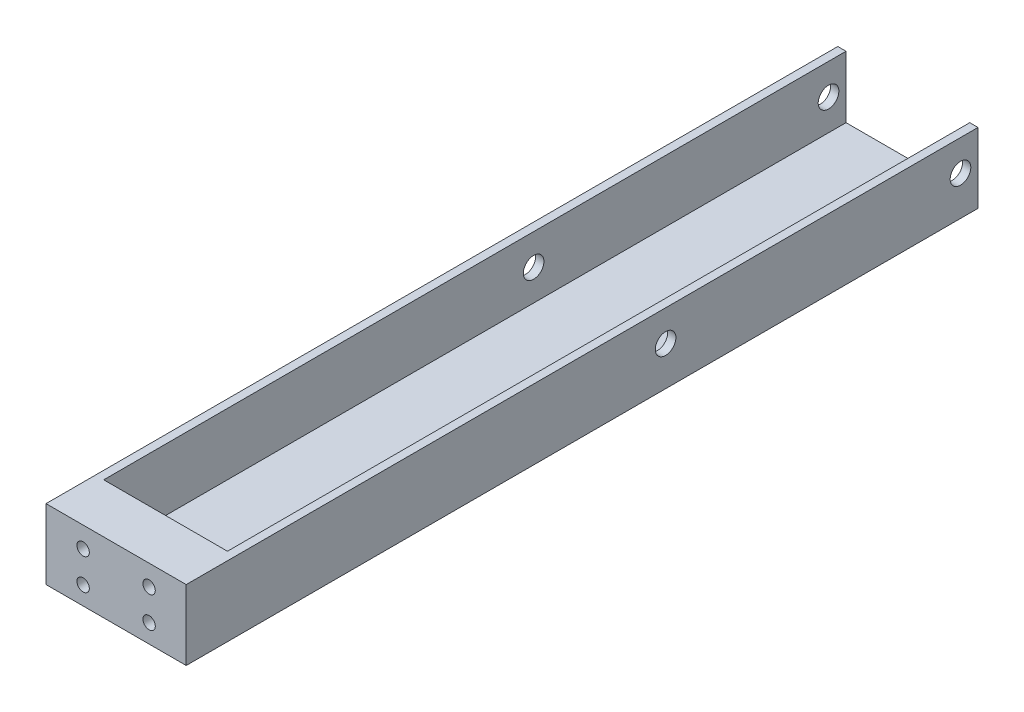
ISO-10303-21;
HEADER;
FILE_DESCRIPTION(('STEP AP214'),'2;1');
FILE_NAME('part.step','',(''),(''),'','','');
FILE_SCHEMA(('AUTOMOTIVE_DESIGN { 1 0 10303 214 1 1 1 1 }'));
ENDSEC;
DATA;
#1=APPLICATION_CONTEXT('core data for automotive mechanical design processes');
#2=APPLICATION_PROTOCOL_DEFINITION('international standard','automotive_design',2000,#1);
#3=PRODUCT_CONTEXT('',#1,'mechanical');
#4=PRODUCT('Part','Part','',(#3));
#5=PRODUCT_RELATED_PRODUCT_CATEGORY('part','',(#4));
#6=PRODUCT_DEFINITION_FORMATION('','',#4);
#7=PRODUCT_DEFINITION_CONTEXT('part definition',#1,'design');
#8=PRODUCT_DEFINITION('design','',#6,#7);
#9=PRODUCT_DEFINITION_SHAPE('','',#8);
#10=(LENGTH_UNIT() NAMED_UNIT(*) SI_UNIT(.MILLI.,.METRE.));
#11=(NAMED_UNIT(*) PLANE_ANGLE_UNIT() SI_UNIT($,.RADIAN.));
#12=(NAMED_UNIT(*) SI_UNIT($,.STERADIAN.) SOLID_ANGLE_UNIT());
#13=UNCERTAINTY_MEASURE_WITH_UNIT(LENGTH_MEASURE(1.E-05),#10,'distance_accuracy_value','');
#14=(GEOMETRIC_REPRESENTATION_CONTEXT(3) GLOBAL_UNCERTAINTY_ASSIGNED_CONTEXT((#13)) GLOBAL_UNIT_ASSIGNED_CONTEXT((#10,
#11,#12)) REPRESENTATION_CONTEXT('',''));
#15=CARTESIAN_POINT('',(0.,0.,0.));
#16=DIRECTION('',(0.,0.,1.));
#17=DIRECTION('',(1.,0.,0.));
#18=AXIS2_PLACEMENT_3D('',#15,#16,#17);
#19=CARTESIAN_POINT('',(0.,0.,0.));
#20=DIRECTION('',(0.,0.,-1.));
#21=DIRECTION('',(-1.,0.,0.));
#22=AXIS2_PLACEMENT_3D('',#19,#20,#21);
#23=PLANE('',#22);
#24=DIRECTION('',(-1.,0.,0.));
#25=VECTOR('',#24,1.);
#26=CARTESIAN_POINT('',(15.,7.5,0.));
#27=LINE('',#26,#25);
#28=CARTESIAN_POINT('',(-15.,7.5,0.));
#29=VERTEX_POINT('',#28);
#30=CARTESIAN_POINT('',(-17.,7.5,0.));
#31=VERTEX_POINT('',#30);
#32=EDGE_CURVE('E61',#29,#31,#27,.T.);
#33=ORIENTED_EDGE('',*,*,#32,.F.);
#34=DIRECTION('',(0.,-1.,0.));
#35=VECTOR('',#34,1.);
#36=CARTESIAN_POINT('',(-15.,7.5,0.));
#37=LINE('',#36,#35);
#38=CARTESIAN_POINT('',(-15.,-7.5,0.));
#39=VERTEX_POINT('',#38);
#40=EDGE_CURVE('E100',#29,#39,#37,.T.);
#41=ORIENTED_EDGE('',*,*,#40,.T.);
#42=DIRECTION('',(1.,0.,0.));
#43=VECTOR('',#42,1.);
#44=CARTESIAN_POINT('',(15.,-7.5,0.));
#45=LINE('',#44,#43);
#46=CARTESIAN_POINT('',(15.,-7.5,0.));
#47=VERTEX_POINT('',#46);
#48=EDGE_CURVE('E178',#39,#47,#45,.T.);
#49=ORIENTED_EDGE('',*,*,#48,.T.);
#50=DIRECTION('',(0.,1.,0.));
#51=VECTOR('',#50,1.);
#52=CARTESIAN_POINT('',(15.,7.5,0.));
#53=LINE('',#52,#51);
#54=CARTESIAN_POINT('',(15.,7.5,0.));
#55=VERTEX_POINT('',#54);
#56=EDGE_CURVE('E52',#47,#55,#53,.T.);
#57=ORIENTED_EDGE('',*,*,#56,.T.);
#58=CARTESIAN_POINT('',(17.,7.5,0.));
#59=VERTEX_POINT('',#58);
#60=EDGE_CURVE('E128',#59,#55,#27,.T.);
#61=ORIENTED_EDGE('',*,*,#60,.F.);
#62=DIRECTION('',(0.,1.,0.));
#63=VECTOR('',#62,1.);
#64=CARTESIAN_POINT('',(17.,0.,0.));
#65=LINE('',#64,#63);
#66=CARTESIAN_POINT('',(17.,-9.5,0.));
#67=VERTEX_POINT('',#66);
#68=EDGE_CURVE('E195',#67,#59,#65,.T.);
#69=ORIENTED_EDGE('',*,*,#68,.F.);
#70=DIRECTION('',(1.,0.,0.));
#71=VECTOR('',#70,1.);
#72=CARTESIAN_POINT('',(0.,-9.5,0.));
#73=LINE('',#72,#71);
#74=CARTESIAN_POINT('',(-17.,-9.5,0.));
#75=VERTEX_POINT('',#74);
#76=EDGE_CURVE('E77',#75,#67,#73,.T.);
#77=ORIENTED_EDGE('',*,*,#76,.F.);
#78=DIRECTION('',(0.,-1.,0.));
#79=VECTOR('',#78,1.);
#80=CARTESIAN_POINT('',(-17.,0.,0.));
#81=LINE('',#80,#79);
#82=EDGE_CURVE('E188',#31,#75,#81,.T.);
#83=ORIENTED_EDGE('',*,*,#82,.F.);
#84=EDGE_LOOP('',(#33,#41,#49,#57,#61,#69,#77,#83));
#85=FACE_BOUND('',#84,.T.);
#86=ADVANCED_FACE('F35',(#85),#23,.T.);
#87=CARTESIAN_POINT('',(-17.,7.5,180.));
#88=DIRECTION('',(1.,0.,0.));
#89=DIRECTION('',(0.,1.,0.));
#90=AXIS2_PLACEMENT_3D('',#87,#88,#89);
#91=PLANE('',#90);
#92=CARTESIAN_POINT('',(-17.,0.,75.7546506274926));
#93=DIRECTION('',(1.,0.,0.));
#94=DIRECTION('',(0.,1.,0.));
#95=AXIS2_PLACEMENT_3D('',#92,#93,#94);
#96=CIRCLE('',#95,2.5);
#97=CARTESIAN_POINT('',(-17.,0.,73.2546506274926));
#98=VERTEX_POINT('',#97);
#99=EDGE_CURVE('E161',#98,#98,#96,.F.);
#100=ORIENTED_EDGE('',*,*,#99,.F.);
#101=EDGE_LOOP('',(#100));
#102=FACE_BOUND('',#101,.T.);
#103=CARTESIAN_POINT('',(-17.,0.,4.24534937250742));
#104=DIRECTION('',(1.,0.,0.));
#105=DIRECTION('',(0.,1.,0.));
#106=AXIS2_PLACEMENT_3D('',#103,#104,#105);
#107=CIRCLE('',#106,2.5);
#108=CARTESIAN_POINT('',(-17.,0.,1.74534937250742));
#109=VERTEX_POINT('',#108);
#110=EDGE_CURVE('E167',#109,#109,#107,.T.);
#111=ORIENTED_EDGE('',*,*,#110,.T.);
#112=EDGE_LOOP('',(#111));
#113=FACE_BOUND('',#112,.T.);
#114=ORIENTED_EDGE('',*,*,#82,.T.);
#115=DIRECTION('',(0.,0.,-1.));
#116=VECTOR('',#115,1.);
#117=CARTESIAN_POINT('',(-17.,-9.5,180.));
#118=LINE('',#117,#116);
#119=CARTESIAN_POINT('',(-17.,-9.5,192.));
#120=VERTEX_POINT('',#119);
#121=EDGE_CURVE('E11',#120,#75,#118,.T.);
#122=ORIENTED_EDGE('',*,*,#121,.F.);
#123=DIRECTION('',(0.,-1.,0.));
#124=VECTOR('',#123,1.);
#125=CARTESIAN_POINT('',(-17.,7.5,192.));
#126=LINE('',#125,#124);
#127=CARTESIAN_POINT('',(-17.,7.5,192.));
#128=VERTEX_POINT('',#127);
#129=EDGE_CURVE('E131',#128,#120,#126,.T.);
#130=ORIENTED_EDGE('',*,*,#129,.F.);
#131=DIRECTION('',(0.,0.,-1.));
#132=VECTOR('',#131,1.);
#133=CARTESIAN_POINT('',(-17.,7.5,180.));
#134=LINE('',#133,#132);
#135=EDGE_CURVE('E118',#128,#31,#134,.T.);
#136=ORIENTED_EDGE('',*,*,#135,.T.);
#137=EDGE_LOOP('',(#114,#122,#130,#136));
#138=FACE_BOUND('',#137,.T.);
#139=ADVANCED_FACE('F132',(#102,#113,#138),#91,.F.);
#140=CARTESIAN_POINT('',(15.,-9.5,180.));
#141=DIRECTION('',(0.,1.,0.));
#142=DIRECTION('',(-1.,0.,0.));
#143=AXIS2_PLACEMENT_3D('',#140,#141,#142);
#144=PLANE('',#143);
#145=ORIENTED_EDGE('',*,*,#76,.T.);
#146=DIRECTION('',(0.,0.,-1.));
#147=VECTOR('',#146,1.);
#148=CARTESIAN_POINT('',(17.,-9.5,180.));
#149=LINE('',#148,#147);
#150=CARTESIAN_POINT('',(17.,-9.49999999999999,192.));
#151=VERTEX_POINT('',#150);
#152=EDGE_CURVE('E44',#151,#67,#149,.T.);
#153=ORIENTED_EDGE('',*,*,#152,.F.);
#154=DIRECTION('',(1.,0.,0.));
#155=VECTOR('',#154,1.);
#156=CARTESIAN_POINT('',(-17.,-9.5,192.));
#157=LINE('',#156,#155);
#158=EDGE_CURVE('E136',#120,#151,#157,.T.);
#159=ORIENTED_EDGE('',*,*,#158,.F.);
#160=ORIENTED_EDGE('',*,*,#121,.T.);
#161=EDGE_LOOP('',(#145,#153,#159,#160));
#162=FACE_BOUND('',#161,.T.);
#163=ADVANCED_FACE('F225',(#162),#144,.F.);
#164=CARTESIAN_POINT('',(17.,7.5,180.));
#165=DIRECTION('',(-1.,0.,0.));
#166=DIRECTION('',(0.,-1.,0.));
#167=AXIS2_PLACEMENT_3D('',#164,#165,#166);
#168=PLANE('',#167);
#169=CARTESIAN_POINT('',(17.,0.,4.24534937250742));
#170=DIRECTION('',(-1.,0.,0.));
#171=DIRECTION('',(0.,-1.,0.));
#172=AXIS2_PLACEMENT_3D('',#169,#170,#171);
#173=CIRCLE('',#172,2.5);
#174=CARTESIAN_POINT('',(17.,0.,6.74534937250742));
#175=VERTEX_POINT('',#174);
#176=EDGE_CURVE('E151',#175,#175,#173,.F.);
#177=ORIENTED_EDGE('',*,*,#176,.F.);
#178=EDGE_LOOP('',(#177));
#179=FACE_BOUND('',#178,.T.);
#180=CARTESIAN_POINT('',(17.,0.,75.7546506274926));
#181=DIRECTION('',(-1.,0.,0.));
#182=DIRECTION('',(0.,-1.,0.));
#183=AXIS2_PLACEMENT_3D('',#180,#181,#182);
#184=CIRCLE('',#183,2.5);
#185=CARTESIAN_POINT('',(17.,0.,78.2546506274926));
#186=VERTEX_POINT('',#185);
#187=EDGE_CURVE('E155',#186,#186,#184,.T.);
#188=ORIENTED_EDGE('',*,*,#187,.T.);
#189=EDGE_LOOP('',(#188));
#190=FACE_BOUND('',#189,.T.);
#191=ORIENTED_EDGE('',*,*,#68,.T.);
#192=DIRECTION('',(0.,0.,-1.));
#193=VECTOR('',#192,1.);
#194=CARTESIAN_POINT('',(17.,7.5,180.));
#195=LINE('',#194,#193);
#196=CARTESIAN_POINT('',(17.,7.50000000000001,192.));
#197=VERTEX_POINT('',#196);
#198=EDGE_CURVE('E127',#197,#59,#195,.T.);
#199=ORIENTED_EDGE('',*,*,#198,.F.);
#200=DIRECTION('',(0.,1.,0.));
#201=VECTOR('',#200,1.);
#202=CARTESIAN_POINT('',(17.,7.50000000000001,192.));
#203=LINE('',#202,#201);
#204=EDGE_CURVE('E141',#151,#197,#203,.T.);
#205=ORIENTED_EDGE('',*,*,#204,.F.);
#206=ORIENTED_EDGE('',*,*,#152,.T.);
#207=EDGE_LOOP('',(#191,#199,#205,#206));
#208=FACE_BOUND('',#207,.T.);
#209=ADVANCED_FACE('F37',(#179,#190,#208),#168,.F.);
#210=CARTESIAN_POINT('',(15.,7.5,180.));
#211=DIRECTION('',(0.,-1.,0.));
#212=DIRECTION('',(1.,0.,0.));
#213=AXIS2_PLACEMENT_3D('',#210,#211,#212);
#214=PLANE('',#213);
#215=DIRECTION('',(-1.,0.,0.));
#216=VECTOR('',#215,1.);
#217=CARTESIAN_POINT('',(15.,7.5,180.));
#218=LINE('',#217,#216);
#219=CARTESIAN_POINT('',(15.,7.5,180.));
#220=VERTEX_POINT('',#219);
#221=CARTESIAN_POINT('',(-15.,7.5,180.));
#222=VERTEX_POINT('',#221);
#223=EDGE_CURVE('E175',#220,#222,#218,.T.);
#224=ORIENTED_EDGE('',*,*,#223,.T.);
#225=DIRECTION('',(0.,0.,-1.));
#226=VECTOR('',#225,1.);
#227=CARTESIAN_POINT('',(-15.,7.5,180.));
#228=LINE('',#227,#226);
#229=EDGE_CURVE('E84',#222,#29,#228,.T.);
#230=ORIENTED_EDGE('',*,*,#229,.T.);
#231=ORIENTED_EDGE('',*,*,#32,.T.);
#232=ORIENTED_EDGE('',*,*,#135,.F.);
#233=DIRECTION('',(-1.,0.,0.));
#234=VECTOR('',#233,1.);
#235=CARTESIAN_POINT('',(-17.,7.5,192.));
#236=LINE('',#235,#234);
#237=EDGE_CURVE('E124',#197,#128,#236,.T.);
#238=ORIENTED_EDGE('',*,*,#237,.F.);
#239=ORIENTED_EDGE('',*,*,#198,.T.);
#240=ORIENTED_EDGE('',*,*,#60,.T.);
#241=DIRECTION('',(0.,0.,-1.));
#242=VECTOR('',#241,1.);
#243=CARTESIAN_POINT('',(15.,7.5,180.));
#244=LINE('',#243,#242);
#245=EDGE_CURVE('E96',#220,#55,#244,.T.);
#246=ORIENTED_EDGE('',*,*,#245,.F.);
#247=EDGE_LOOP('',(#224,#230,#231,#232,#238,#239,#240,#246));
#248=FACE_BOUND('',#247,.T.);
#249=ADVANCED_FACE('F121',(#248),#214,.F.);
#250=CARTESIAN_POINT('',(-15.,7.5,180.));
#251=DIRECTION('',(1.,0.,0.));
#252=DIRECTION('',(0.,1.,0.));
#253=AXIS2_PLACEMENT_3D('',#250,#251,#252);
#254=PLANE('',#253);
#255=CARTESIAN_POINT('',(-15.,0.,75.7546506274926));
#256=DIRECTION('',(1.,0.,0.));
#257=DIRECTION('',(0.,1.,0.));
#258=AXIS2_PLACEMENT_3D('',#255,#256,#257);
#259=CIRCLE('',#258,2.5);
#260=CARTESIAN_POINT('',(-15.,0.,73.2546506274926));
#261=VERTEX_POINT('',#260);
#262=EDGE_CURVE('E158',#261,#261,#259,.F.);
#263=ORIENTED_EDGE('',*,*,#262,.T.);
#264=EDGE_LOOP('',(#263));
#265=FACE_BOUND('',#264,.T.);
#266=CARTESIAN_POINT('',(-15.,0.,4.24534937250742));
#267=DIRECTION('',(1.,0.,0.));
#268=DIRECTION('',(0.,1.,0.));
#269=AXIS2_PLACEMENT_3D('',#266,#267,#268);
#270=CIRCLE('',#269,2.5);
#271=CARTESIAN_POINT('',(-15.,0.,1.74534937250742));
#272=VERTEX_POINT('',#271);
#273=EDGE_CURVE('E164',#272,#272,#270,.T.);
#274=ORIENTED_EDGE('',*,*,#273,.F.);
#275=EDGE_LOOP('',(#274));
#276=FACE_BOUND('',#275,.T.);
#277=ORIENTED_EDGE('',*,*,#40,.F.);
#278=ORIENTED_EDGE('',*,*,#229,.F.);
#279=DIRECTION('',(0.,-1.,0.));
#280=VECTOR('',#279,1.);
#281=CARTESIAN_POINT('',(-15.,7.5,180.));
#282=LINE('',#281,#280);
#283=CARTESIAN_POINT('',(-15.,-7.5,180.));
#284=VERTEX_POINT('',#283);
#285=EDGE_CURVE('E170',#222,#284,#282,.T.);
#286=ORIENTED_EDGE('',*,*,#285,.T.);
#287=DIRECTION('',(0.,0.,-1.));
#288=VECTOR('',#287,1.);
#289=CARTESIAN_POINT('',(-15.,-7.5,180.));
#290=LINE('',#289,#288);
#291=EDGE_CURVE('E186',#284,#39,#290,.T.);
#292=ORIENTED_EDGE('',*,*,#291,.T.);
#293=EDGE_LOOP('',(#277,#278,#286,#292));
#294=FACE_BOUND('',#293,.T.);
#295=ADVANCED_FACE('F216',(#265,#276,#294),#254,.T.);
#296=CARTESIAN_POINT('',(15.,-7.5,180.));
#297=DIRECTION('',(0.,1.,0.));
#298=DIRECTION('',(-1.,0.,0.));
#299=AXIS2_PLACEMENT_3D('',#296,#297,#298);
#300=PLANE('',#299);
#301=ORIENTED_EDGE('',*,*,#48,.F.);
#302=ORIENTED_EDGE('',*,*,#291,.F.);
#303=DIRECTION('',(1.,0.,0.));
#304=VECTOR('',#303,1.);
#305=CARTESIAN_POINT('',(15.,-7.5,180.));
#306=LINE('',#305,#304);
#307=CARTESIAN_POINT('',(15.,-7.5,180.));
#308=VERTEX_POINT('',#307);
#309=EDGE_CURVE('E106',#284,#308,#306,.T.);
#310=ORIENTED_EDGE('',*,*,#309,.T.);
#311=DIRECTION('',(0.,0.,-1.));
#312=VECTOR('',#311,1.);
#313=CARTESIAN_POINT('',(15.,-7.5,180.));
#314=LINE('',#313,#312);
#315=EDGE_CURVE('E184',#308,#47,#314,.T.);
#316=ORIENTED_EDGE('',*,*,#315,.T.);
#317=EDGE_LOOP('',(#301,#302,#310,#316));
#318=FACE_BOUND('',#317,.T.);
#319=ADVANCED_FACE('F206',(#318),#300,.T.);
#320=CARTESIAN_POINT('',(15.,7.5,180.));
#321=DIRECTION('',(-1.,0.,0.));
#322=DIRECTION('',(0.,-1.,0.));
#323=AXIS2_PLACEMENT_3D('',#320,#321,#322);
#324=PLANE('',#323);
#325=CARTESIAN_POINT('',(15.,0.,4.24534937250742));
#326=DIRECTION('',(-1.,0.,0.));
#327=DIRECTION('',(0.,-1.,0.));
#328=AXIS2_PLACEMENT_3D('',#325,#326,#327);
#329=CIRCLE('',#328,2.5);
#330=CARTESIAN_POINT('',(15.,0.,6.74534937250742));
#331=VERTEX_POINT('',#330);
#332=EDGE_CURVE('E39',#331,#331,#329,.F.);
#333=ORIENTED_EDGE('',*,*,#332,.T.);
#334=EDGE_LOOP('',(#333));
#335=FACE_BOUND('',#334,.T.);
#336=CARTESIAN_POINT('',(15.,0.,75.7546506274926));
#337=DIRECTION('',(-1.,0.,0.));
#338=DIRECTION('',(0.,-1.,0.));
#339=AXIS2_PLACEMENT_3D('',#336,#337,#338);
#340=CIRCLE('',#339,2.5);
#341=CARTESIAN_POINT('',(15.,0.,78.2546506274926));
#342=VERTEX_POINT('',#341);
#343=EDGE_CURVE('E154',#342,#342,#340,.T.);
#344=ORIENTED_EDGE('',*,*,#343,.F.);
#345=EDGE_LOOP('',(#344));
#346=FACE_BOUND('',#345,.T.);
#347=ORIENTED_EDGE('',*,*,#56,.F.);
#348=ORIENTED_EDGE('',*,*,#315,.F.);
#349=DIRECTION('',(0.,1.,0.));
#350=VECTOR('',#349,1.);
#351=CARTESIAN_POINT('',(15.,7.5,180.));
#352=LINE('',#351,#350);
#353=EDGE_CURVE('E173',#308,#220,#352,.T.);
#354=ORIENTED_EDGE('',*,*,#353,.T.);
#355=ORIENTED_EDGE('',*,*,#245,.T.);
#356=EDGE_LOOP('',(#347,#348,#354,#355));
#357=FACE_BOUND('',#356,.T.);
#358=ADVANCED_FACE('F203',(#335,#346,#357),#324,.T.);
#359=CARTESIAN_POINT('',(0.,0.,180.));
#360=DIRECTION('',(0.,0.,-1.));
#361=DIRECTION('',(-1.,0.,0.));
#362=AXIS2_PLACEMENT_3D('',#359,#360,#361);
#363=PLANE('',#362);
#364=CARTESIAN_POINT('',(8.,-5.,180.));
#365=DIRECTION('',(0.,0.,-1.));
#366=DIRECTION('',(-1.,0.,0.));
#367=AXIS2_PLACEMENT_3D('',#364,#365,#366);
#368=CIRCLE('',#367,1.5);
#369=CARTESIAN_POINT('',(6.5,-5.,180.));
#370=VERTEX_POINT('',#369);
#371=EDGE_CURVE('E290',#370,#370,#368,.T.);
#372=ORIENTED_EDGE('',*,*,#371,.F.);
#373=EDGE_LOOP('',(#372));
#374=FACE_BOUND('',#373,.T.);
#375=CARTESIAN_POINT('',(8.,2.5,180.));
#376=DIRECTION('',(0.,0.,-1.));
#377=DIRECTION('',(-1.,0.,0.));
#378=AXIS2_PLACEMENT_3D('',#375,#376,#377);
#379=CIRCLE('',#378,1.5);
#380=CARTESIAN_POINT('',(6.5,2.5,180.));
#381=VERTEX_POINT('',#380);
#382=EDGE_CURVE('E142',#381,#381,#379,.T.);
#383=ORIENTED_EDGE('',*,*,#382,.F.);
#384=EDGE_LOOP('',(#383));
#385=FACE_BOUND('',#384,.T.);
#386=CARTESIAN_POINT('',(-8.,-5.05433052575199,180.));
#387=DIRECTION('',(0.,0.,-1.));
#388=DIRECTION('',(-1.,0.,0.));
#389=AXIS2_PLACEMENT_3D('',#386,#387,#388);
#390=CIRCLE('',#389,1.5);
#391=CARTESIAN_POINT('',(-9.5,-5.05433052575199,180.));
#392=VERTEX_POINT('',#391);
#393=EDGE_CURVE('E145',#392,#392,#390,.T.);
#394=ORIENTED_EDGE('',*,*,#393,.F.);
#395=EDGE_LOOP('',(#394));
#396=FACE_BOUND('',#395,.T.);
#397=CARTESIAN_POINT('',(-8.,2.5,180.));
#398=DIRECTION('',(0.,0.,-1.));
#399=DIRECTION('',(-1.,0.,0.));
#400=AXIS2_PLACEMENT_3D('',#397,#398,#399);
#401=CIRCLE('',#400,1.5);
#402=CARTESIAN_POINT('',(-9.5,2.5,180.));
#403=VERTEX_POINT('',#402);
#404=EDGE_CURVE('E306',#403,#403,#401,.T.);
#405=ORIENTED_EDGE('',*,*,#404,.F.);
#406=EDGE_LOOP('',(#405));
#407=FACE_BOUND('',#406,.T.);
#408=ORIENTED_EDGE('',*,*,#285,.F.);
#409=ORIENTED_EDGE('',*,*,#223,.F.);
#410=ORIENTED_EDGE('',*,*,#353,.F.);
#411=ORIENTED_EDGE('',*,*,#309,.F.);
#412=EDGE_LOOP('',(#408,#409,#410,#411));
#413=FACE_BOUND('',#412,.T.);
#414=ADVANCED_FACE('F205',(#374,#385,#396,#407,#413),#363,.T.);
#415=CARTESIAN_POINT('',(-35.,0.,4.24534937250742));
#416=DIRECTION('',(1.,0.,0.));
#417=DIRECTION('',(0.,0.,-1.));
#418=AXIS2_PLACEMENT_3D('',#415,#416,#417);
#419=CYLINDRICAL_SURFACE('',#418,2.5);
#420=CARTESIAN_POINT('',(-15.,0.,1.74534937250742));
#421=CARTESIAN_POINT('',(-15.0208333333333,0.,1.74534937250742));
#422=CARTESIAN_POINT('',(-15.0416666666667,0.,1.74534937250742));
#423=CARTESIAN_POINT('',(-15.0833333333333,0.,1.74534937250742));
#424=CARTESIAN_POINT('',(-15.1041666666667,0.,1.74534937250742));
#425=CARTESIAN_POINT('',(-15.1458333333333,0.,1.74534937250742));
#426=CARTESIAN_POINT('',(-15.1666666666667,0.,1.74534937250742));
#427=CARTESIAN_POINT('',(-15.2083333333333,0.,1.74534937250742));
#428=CARTESIAN_POINT('',(-15.2291666666667,0.,1.74534937250742));
#429=CARTESIAN_POINT('',(-15.2708333333333,0.,1.74534937250742));
#430=CARTESIAN_POINT('',(-15.2916666666667,0.,1.74534937250742));
#431=CARTESIAN_POINT('',(-15.3333333333333,0.,1.74534937250742));
#432=CARTESIAN_POINT('',(-15.3541666666667,0.,1.74534937250742));
#433=CARTESIAN_POINT('',(-15.3958333333333,0.,1.74534937250742));
#434=CARTESIAN_POINT('',(-15.4166666666667,0.,1.74534937250742));
#435=CARTESIAN_POINT('',(-15.4583333333333,0.,1.74534937250742));
#436=CARTESIAN_POINT('',(-15.4791666666667,0.,1.74534937250742));
#437=CARTESIAN_POINT('',(-15.5208333333333,0.,1.74534937250742));
#438=CARTESIAN_POINT('',(-15.5416666666667,0.,1.74534937250742));
#439=CARTESIAN_POINT('',(-15.5833333333333,0.,1.74534937250742));
#440=CARTESIAN_POINT('',(-15.6041666666667,0.,1.74534937250742));
#441=CARTESIAN_POINT('',(-15.6458333333333,0.,1.74534937250742));
#442=CARTESIAN_POINT('',(-15.6666666666667,0.,1.74534937250742));
#443=CARTESIAN_POINT('',(-15.7083333333333,0.,1.74534937250742));
#444=CARTESIAN_POINT('',(-15.7291666666667,0.,1.74534937250742));
#445=CARTESIAN_POINT('',(-15.7708333333333,0.,1.74534937250742));
#446=CARTESIAN_POINT('',(-15.7916666666667,0.,1.74534937250742));
#447=CARTESIAN_POINT('',(-15.8333333333333,0.,1.74534937250742));
#448=CARTESIAN_POINT('',(-15.8541666666667,0.,1.74534937250742));
#449=CARTESIAN_POINT('',(-15.8958333333333,0.,1.74534937250742));
#450=CARTESIAN_POINT('',(-15.9166666666667,0.,1.74534937250742));
#451=CARTESIAN_POINT('',(-15.9583333333333,0.,1.74534937250742));
#452=CARTESIAN_POINT('',(-15.9791666666667,0.,1.74534937250742));
#453=CARTESIAN_POINT('',(-16.0208333333333,0.,1.74534937250742));
#454=CARTESIAN_POINT('',(-16.0416666666667,0.,1.74534937250742));
#455=CARTESIAN_POINT('',(-16.0833333333333,0.,1.74534937250742));
#456=CARTESIAN_POINT('',(-16.1041666666667,0.,1.74534937250742));
#457=CARTESIAN_POINT('',(-16.1458333333333,0.,1.74534937250742));
#458=CARTESIAN_POINT('',(-16.1666666666667,0.,1.74534937250742));
#459=CARTESIAN_POINT('',(-16.2083333333333,0.,1.74534937250742));
#460=CARTESIAN_POINT('',(-16.2291666666667,0.,1.74534937250742));
#461=CARTESIAN_POINT('',(-16.2708333333333,0.,1.74534937250742));
#462=CARTESIAN_POINT('',(-16.2916666666667,0.,1.74534937250742));
#463=CARTESIAN_POINT('',(-16.3333333333333,0.,1.74534937250742));
#464=CARTESIAN_POINT('',(-16.3541666666667,0.,1.74534937250742));
#465=CARTESIAN_POINT('',(-16.3958333333333,0.,1.74534937250742));
#466=CARTESIAN_POINT('',(-16.4166666666667,0.,1.74534937250742));
#467=CARTESIAN_POINT('',(-16.4583333333333,0.,1.74534937250742));
#468=CARTESIAN_POINT('',(-16.4791666666667,0.,1.74534937250742));
#469=CARTESIAN_POINT('',(-16.5208333333333,0.,1.74534937250742));
#470=CARTESIAN_POINT('',(-16.5416666666667,0.,1.74534937250742));
#471=CARTESIAN_POINT('',(-16.5833333333333,0.,1.74534937250742));
#472=CARTESIAN_POINT('',(-16.6041666666667,0.,1.74534937250742));
#473=CARTESIAN_POINT('',(-16.6458333333333,0.,1.74534937250742));
#474=CARTESIAN_POINT('',(-16.6666666666667,0.,1.74534937250742));
#475=CARTESIAN_POINT('',(-16.7083333333333,0.,1.74534937250742));
#476=CARTESIAN_POINT('',(-16.7291666666667,0.,1.74534937250742));
#477=CARTESIAN_POINT('',(-16.7708333333333,0.,1.74534937250742));
#478=CARTESIAN_POINT('',(-16.7916666666667,0.,1.74534937250742));
#479=CARTESIAN_POINT('',(-16.8333333333333,0.,1.74534937250742));
#480=CARTESIAN_POINT('',(-16.8541666666667,0.,1.74534937250742));
#481=CARTESIAN_POINT('',(-16.8958333333333,0.,1.74534937250742));
#482=CARTESIAN_POINT('',(-16.9166666666667,0.,1.74534937250742));
#483=CARTESIAN_POINT('',(-16.9583333333333,0.,1.74534937250742));
#484=CARTESIAN_POINT('',(-16.9791666666667,0.,1.74534937250742));
#485=CARTESIAN_POINT('',(-17.,0.,1.74534937250742));
#486=B_SPLINE_CURVE_WITH_KNOTS('',3,(#420,#421,#422,#423,#424,#425,#426,#427,#428,#429,#430,
#431,#432,#433,#434,#435,#436,#437,#438,#439,#440,#441,#442,#443,#444,#445,#446,#447,#448,#449,
#450,#451,#452,#453,#454,#455,#456,#457,#458,#459,#460,#461,#462,#463,#464,#465,#466,#467,#468,
#469,#470,#471,#472,#473,#474,#475,#476,#477,#478,#479,#480,#481,#482,#483,#484,#485),
.UNSPECIFIED.,.F.,.F.,(4,2,2,2,2,2,2,2,2,2,2,2,2,2,2,2,2,2,2,2,2,2,2,2,2,2,2,2,2,2,2,2,4),(0.,
0.0625000000000001,0.125,0.1875,0.25,0.3125,0.375,0.4375,0.5,0.5625,0.625000000000001,
0.687500000000001,0.750000000000001,0.812500000000001,0.875000000000001,0.937500000000001,1.,
1.0625,1.125,1.1875,1.25,1.3125,1.375,1.4375,1.5,1.5625,1.625,1.6875,1.75,1.8125,1.875,1.9375,
2.),.UNSPECIFIED.);
#487=EDGE_CURVE('BSEAM213',#272,#109,#486,.T.);
#488=ORIENTED_EDGE('',*,*,#273,.T.);
#489=ORIENTED_EDGE('',*,*,#110,.F.);
#490=ORIENTED_EDGE('',*,*,#487,.T.);
#491=ORIENTED_EDGE('',*,*,#487,.F.);
#492=EDGE_LOOP('',(#488,#490,#489,#491));
#493=FACE_BOUND('',#492,.T.);
#494=ADVANCED_FACE('F213',(#493),#419,.F.);
#495=CARTESIAN_POINT('',(-35.,0.,75.7546506274926));
#496=DIRECTION('',(1.,0.,0.));
#497=DIRECTION('',(0.,0.,-1.));
#498=AXIS2_PLACEMENT_3D('',#495,#496,#497);
#499=CYLINDRICAL_SURFACE('',#498,2.5);
#500=CARTESIAN_POINT('',(-15.,0.,73.2546506274926));
#501=CARTESIAN_POINT('',(-15.0208333333333,0.,73.2546506274926));
#502=CARTESIAN_POINT('',(-15.0416666666667,0.,73.2546506274926));
#503=CARTESIAN_POINT('',(-15.0833333333333,0.,73.2546506274926));
#504=CARTESIAN_POINT('',(-15.1041666666667,0.,73.2546506274926));
#505=CARTESIAN_POINT('',(-15.1458333333333,0.,73.2546506274926));
#506=CARTESIAN_POINT('',(-15.1666666666667,0.,73.2546506274926));
#507=CARTESIAN_POINT('',(-15.2083333333333,0.,73.2546506274926));
#508=CARTESIAN_POINT('',(-15.2291666666667,0.,73.2546506274926));
#509=CARTESIAN_POINT('',(-15.2708333333333,0.,73.2546506274926));
#510=CARTESIAN_POINT('',(-15.2916666666667,0.,73.2546506274926));
#511=CARTESIAN_POINT('',(-15.3333333333333,0.,73.2546506274926));
#512=CARTESIAN_POINT('',(-15.3541666666667,0.,73.2546506274926));
#513=CARTESIAN_POINT('',(-15.3958333333333,0.,73.2546506274926));
#514=CARTESIAN_POINT('',(-15.4166666666667,0.,73.2546506274926));
#515=CARTESIAN_POINT('',(-15.4583333333333,0.,73.2546506274926));
#516=CARTESIAN_POINT('',(-15.4791666666667,0.,73.2546506274926));
#517=CARTESIAN_POINT('',(-15.5208333333333,0.,73.2546506274926));
#518=CARTESIAN_POINT('',(-15.5416666666667,0.,73.2546506274926));
#519=CARTESIAN_POINT('',(-15.5833333333333,0.,73.2546506274926));
#520=CARTESIAN_POINT('',(-15.6041666666667,0.,73.2546506274926));
#521=CARTESIAN_POINT('',(-15.6458333333333,0.,73.2546506274926));
#522=CARTESIAN_POINT('',(-15.6666666666667,0.,73.2546506274926));
#523=CARTESIAN_POINT('',(-15.7083333333333,0.,73.2546506274926));
#524=CARTESIAN_POINT('',(-15.7291666666667,0.,73.2546506274926));
#525=CARTESIAN_POINT('',(-15.7708333333333,0.,73.2546506274926));
#526=CARTESIAN_POINT('',(-15.7916666666667,0.,73.2546506274926));
#527=CARTESIAN_POINT('',(-15.8333333333333,0.,73.2546506274926));
#528=CARTESIAN_POINT('',(-15.8541666666667,0.,73.2546506274926));
#529=CARTESIAN_POINT('',(-15.8958333333333,0.,73.2546506274926));
#530=CARTESIAN_POINT('',(-15.9166666666667,0.,73.2546506274926));
#531=CARTESIAN_POINT('',(-15.9583333333333,0.,73.2546506274926));
#532=CARTESIAN_POINT('',(-15.9791666666667,0.,73.2546506274926));
#533=CARTESIAN_POINT('',(-16.0208333333333,0.,73.2546506274926));
#534=CARTESIAN_POINT('',(-16.0416666666667,0.,73.2546506274926));
#535=CARTESIAN_POINT('',(-16.0833333333333,0.,73.2546506274926));
#536=CARTESIAN_POINT('',(-16.1041666666667,0.,73.2546506274926));
#537=CARTESIAN_POINT('',(-16.1458333333333,0.,73.2546506274926));
#538=CARTESIAN_POINT('',(-16.1666666666667,0.,73.2546506274926));
#539=CARTESIAN_POINT('',(-16.2083333333333,0.,73.2546506274926));
#540=CARTESIAN_POINT('',(-16.2291666666667,0.,73.2546506274926));
#541=CARTESIAN_POINT('',(-16.2708333333333,0.,73.2546506274926));
#542=CARTESIAN_POINT('',(-16.2916666666667,0.,73.2546506274926));
#543=CARTESIAN_POINT('',(-16.3333333333333,0.,73.2546506274926));
#544=CARTESIAN_POINT('',(-16.3541666666667,0.,73.2546506274926));
#545=CARTESIAN_POINT('',(-16.3958333333333,0.,73.2546506274926));
#546=CARTESIAN_POINT('',(-16.4166666666667,0.,73.2546506274926));
#547=CARTESIAN_POINT('',(-16.4583333333333,0.,73.2546506274926));
#548=CARTESIAN_POINT('',(-16.4791666666667,0.,73.2546506274926));
#549=CARTESIAN_POINT('',(-16.5208333333333,0.,73.2546506274926));
#550=CARTESIAN_POINT('',(-16.5416666666667,0.,73.2546506274926));
#551=CARTESIAN_POINT('',(-16.5833333333333,0.,73.2546506274926));
#552=CARTESIAN_POINT('',(-16.6041666666667,0.,73.2546506274926));
#553=CARTESIAN_POINT('',(-16.6458333333333,0.,73.2546506274926));
#554=CARTESIAN_POINT('',(-16.6666666666667,0.,73.2546506274926));
#555=CARTESIAN_POINT('',(-16.7083333333333,0.,73.2546506274926));
#556=CARTESIAN_POINT('',(-16.7291666666667,0.,73.2546506274926));
#557=CARTESIAN_POINT('',(-16.7708333333333,0.,73.2546506274926));
#558=CARTESIAN_POINT('',(-16.7916666666667,0.,73.2546506274926));
#559=CARTESIAN_POINT('',(-16.8333333333333,0.,73.2546506274926));
#560=CARTESIAN_POINT('',(-16.8541666666667,0.,73.2546506274926));
#561=CARTESIAN_POINT('',(-16.8958333333333,0.,73.2546506274926));
#562=CARTESIAN_POINT('',(-16.9166666666667,0.,73.2546506274926));
#563=CARTESIAN_POINT('',(-16.9583333333333,0.,73.2546506274926));
#564=CARTESIAN_POINT('',(-16.9791666666667,0.,73.2546506274926));
#565=CARTESIAN_POINT('',(-17.,0.,73.2546506274926));
#566=B_SPLINE_CURVE_WITH_KNOTS('',3,(#500,#501,#502,#503,#504,#505,#506,#507,#508,#509,#510,
#511,#512,#513,#514,#515,#516,#517,#518,#519,#520,#521,#522,#523,#524,#525,#526,#527,#528,#529,
#530,#531,#532,#533,#534,#535,#536,#537,#538,#539,#540,#541,#542,#543,#544,#545,#546,#547,#548,
#549,#550,#551,#552,#553,#554,#555,#556,#557,#558,#559,#560,#561,#562,#563,#564,#565),
.UNSPECIFIED.,.F.,.F.,(4,2,2,2,2,2,2,2,2,2,2,2,2,2,2,2,2,2,2,2,2,2,2,2,2,2,2,2,2,2,2,2,4),(0.,
0.0625000000000001,0.125,0.1875,0.25,0.3125,0.375,0.4375,0.5,0.5625,0.625000000000001,
0.687500000000001,0.750000000000001,0.812500000000001,0.875000000000001,0.937500000000001,1.,
1.0625,1.125,1.1875,1.25,1.3125,1.375,1.4375,1.5,1.5625,1.625,1.6875,1.75,1.8125,1.875,1.9375,
2.),.UNSPECIFIED.);
#567=EDGE_CURVE('BSEAM251',#261,#98,#566,.T.);
#568=ORIENTED_EDGE('',*,*,#262,.F.);
#569=ORIENTED_EDGE('',*,*,#99,.T.);
#570=ORIENTED_EDGE('',*,*,#567,.T.);
#571=ORIENTED_EDGE('',*,*,#567,.F.);
#572=EDGE_LOOP('',(#568,#570,#569,#571));
#573=FACE_BOUND('',#572,.T.);
#574=ADVANCED_FACE('F251',(#573),#499,.F.);
#575=CARTESIAN_POINT('',(35.,0.,75.7546506274926));
#576=DIRECTION('',(-1.,0.,0.));
#577=DIRECTION('',(0.,0.,1.));
#578=AXIS2_PLACEMENT_3D('',#575,#576,#577);
#579=CYLINDRICAL_SURFACE('',#578,2.5);
#580=CARTESIAN_POINT('',(15.,0.,78.2546506274926));
#581=CARTESIAN_POINT('',(15.0208333333333,0.,78.2546506274926));
#582=CARTESIAN_POINT('',(15.0416666666667,0.,78.2546506274926));
#583=CARTESIAN_POINT('',(15.0833333333333,0.,78.2546506274926));
#584=CARTESIAN_POINT('',(15.1041666666667,0.,78.2546506274926));
#585=CARTESIAN_POINT('',(15.1458333333333,0.,78.2546506274926));
#586=CARTESIAN_POINT('',(15.1666666666667,0.,78.2546506274926));
#587=CARTESIAN_POINT('',(15.2083333333333,0.,78.2546506274926));
#588=CARTESIAN_POINT('',(15.2291666666667,0.,78.2546506274926));
#589=CARTESIAN_POINT('',(15.2708333333333,0.,78.2546506274926));
#590=CARTESIAN_POINT('',(15.2916666666667,0.,78.2546506274926));
#591=CARTESIAN_POINT('',(15.3333333333333,0.,78.2546506274926));
#592=CARTESIAN_POINT('',(15.3541666666667,0.,78.2546506274926));
#593=CARTESIAN_POINT('',(15.3958333333333,0.,78.2546506274926));
#594=CARTESIAN_POINT('',(15.4166666666667,0.,78.2546506274926));
#595=CARTESIAN_POINT('',(15.4583333333333,0.,78.2546506274926));
#596=CARTESIAN_POINT('',(15.4791666666667,0.,78.2546506274926));
#597=CARTESIAN_POINT('',(15.5208333333333,0.,78.2546506274926));
#598=CARTESIAN_POINT('',(15.5416666666667,0.,78.2546506274926));
#599=CARTESIAN_POINT('',(15.5833333333333,0.,78.2546506274926));
#600=CARTESIAN_POINT('',(15.6041666666667,0.,78.2546506274926));
#601=CARTESIAN_POINT('',(15.6458333333333,0.,78.2546506274926));
#602=CARTESIAN_POINT('',(15.6666666666667,0.,78.2546506274926));
#603=CARTESIAN_POINT('',(15.7083333333333,0.,78.2546506274926));
#604=CARTESIAN_POINT('',(15.7291666666667,0.,78.2546506274926));
#605=CARTESIAN_POINT('',(15.7708333333333,0.,78.2546506274926));
#606=CARTESIAN_POINT('',(15.7916666666667,0.,78.2546506274926));
#607=CARTESIAN_POINT('',(15.8333333333333,0.,78.2546506274926));
#608=CARTESIAN_POINT('',(15.8541666666667,0.,78.2546506274926));
#609=CARTESIAN_POINT('',(15.8958333333333,0.,78.2546506274926));
#610=CARTESIAN_POINT('',(15.9166666666667,0.,78.2546506274926));
#611=CARTESIAN_POINT('',(15.9583333333333,0.,78.2546506274926));
#612=CARTESIAN_POINT('',(15.9791666666667,0.,78.2546506274926));
#613=CARTESIAN_POINT('',(16.0208333333333,0.,78.2546506274926));
#614=CARTESIAN_POINT('',(16.0416666666667,0.,78.2546506274926));
#615=CARTESIAN_POINT('',(16.0833333333333,0.,78.2546506274926));
#616=CARTESIAN_POINT('',(16.1041666666667,0.,78.2546506274926));
#617=CARTESIAN_POINT('',(16.1458333333333,0.,78.2546506274926));
#618=CARTESIAN_POINT('',(16.1666666666667,0.,78.2546506274926));
#619=CARTESIAN_POINT('',(16.2083333333333,0.,78.2546506274926));
#620=CARTESIAN_POINT('',(16.2291666666667,0.,78.2546506274926));
#621=CARTESIAN_POINT('',(16.2708333333333,0.,78.2546506274926));
#622=CARTESIAN_POINT('',(16.2916666666667,0.,78.2546506274926));
#623=CARTESIAN_POINT('',(16.3333333333333,0.,78.2546506274926));
#624=CARTESIAN_POINT('',(16.3541666666667,0.,78.2546506274926));
#625=CARTESIAN_POINT('',(16.3958333333333,0.,78.2546506274926));
#626=CARTESIAN_POINT('',(16.4166666666667,0.,78.2546506274926));
#627=CARTESIAN_POINT('',(16.4583333333333,0.,78.2546506274926));
#628=CARTESIAN_POINT('',(16.4791666666667,0.,78.2546506274926));
#629=CARTESIAN_POINT('',(16.5208333333333,0.,78.2546506274926));
#630=CARTESIAN_POINT('',(16.5416666666667,0.,78.2546506274926));
#631=CARTESIAN_POINT('',(16.5833333333333,0.,78.2546506274926));
#632=CARTESIAN_POINT('',(16.6041666666667,0.,78.2546506274926));
#633=CARTESIAN_POINT('',(16.6458333333333,0.,78.2546506274926));
#634=CARTESIAN_POINT('',(16.6666666666667,0.,78.2546506274926));
#635=CARTESIAN_POINT('',(16.7083333333333,0.,78.2546506274926));
#636=CARTESIAN_POINT('',(16.7291666666667,0.,78.2546506274926));
#637=CARTESIAN_POINT('',(16.7708333333333,0.,78.2546506274926));
#638=CARTESIAN_POINT('',(16.7916666666667,0.,78.2546506274926));
#639=CARTESIAN_POINT('',(16.8333333333333,0.,78.2546506274926));
#640=CARTESIAN_POINT('',(16.8541666666667,0.,78.2546506274926));
#641=CARTESIAN_POINT('',(16.8958333333333,0.,78.2546506274926));
#642=CARTESIAN_POINT('',(16.9166666666667,0.,78.2546506274926));
#643=CARTESIAN_POINT('',(16.9583333333333,0.,78.2546506274926));
#644=CARTESIAN_POINT('',(16.9791666666667,0.,78.2546506274926));
#645=CARTESIAN_POINT('',(17.,0.,78.2546506274926));
#646=B_SPLINE_CURVE_WITH_KNOTS('',3,(#580,#581,#582,#583,#584,#585,#586,#587,#588,#589,#590,
#591,#592,#593,#594,#595,#596,#597,#598,#599,#600,#601,#602,#603,#604,#605,#606,#607,#608,#609,
#610,#611,#612,#613,#614,#615,#616,#617,#618,#619,#620,#621,#622,#623,#624,#625,#626,#627,#628,
#629,#630,#631,#632,#633,#634,#635,#636,#637,#638,#639,#640,#641,#642,#643,#644,#645),
.UNSPECIFIED.,.F.,.F.,(4,2,2,2,2,2,2,2,2,2,2,2,2,2,2,2,2,2,2,2,2,2,2,2,2,2,2,2,2,2,2,2,4),(0.,
0.0625000000000001,0.125,0.1875,0.25,0.3125,0.375,0.4375,0.5,0.5625,0.625000000000001,
0.687500000000001,0.750000000000001,0.812500000000001,0.875000000000001,0.937500000000001,1.,
1.0625,1.125,1.1875,1.25,1.3125,1.375,1.4375,1.5,1.5625,1.625,1.6875,1.75,1.8125,1.875,1.9375,
2.),.UNSPECIFIED.);
#647=EDGE_CURVE('BSEAM200',#342,#186,#646,.T.);
#648=ORIENTED_EDGE('',*,*,#343,.T.);
#649=ORIENTED_EDGE('',*,*,#187,.F.);
#650=ORIENTED_EDGE('',*,*,#647,.T.);
#651=ORIENTED_EDGE('',*,*,#647,.F.);
#652=EDGE_LOOP('',(#648,#650,#649,#651));
#653=FACE_BOUND('',#652,.T.);
#654=ADVANCED_FACE('F200',(#653),#579,.F.);
#655=CARTESIAN_POINT('',(35.,0.,4.24534937250742));
#656=DIRECTION('',(-1.,0.,0.));
#657=DIRECTION('',(0.,0.,1.));
#658=AXIS2_PLACEMENT_3D('',#655,#656,#657);
#659=CYLINDRICAL_SURFACE('',#658,2.5);
#660=CARTESIAN_POINT('',(15.,0.,6.74534937250742));
#661=CARTESIAN_POINT('',(15.0208333333333,0.,6.74534937250742));
#662=CARTESIAN_POINT('',(15.0416666666667,0.,6.74534937250742));
#663=CARTESIAN_POINT('',(15.0833333333333,0.,6.74534937250742));
#664=CARTESIAN_POINT('',(15.1041666666667,0.,6.74534937250742));
#665=CARTESIAN_POINT('',(15.1458333333333,0.,6.74534937250742));
#666=CARTESIAN_POINT('',(15.1666666666667,0.,6.74534937250742));
#667=CARTESIAN_POINT('',(15.2083333333333,0.,6.74534937250742));
#668=CARTESIAN_POINT('',(15.2291666666667,0.,6.74534937250742));
#669=CARTESIAN_POINT('',(15.2708333333333,0.,6.74534937250742));
#670=CARTESIAN_POINT('',(15.2916666666667,0.,6.74534937250742));
#671=CARTESIAN_POINT('',(15.3333333333333,0.,6.74534937250742));
#672=CARTESIAN_POINT('',(15.3541666666667,0.,6.74534937250742));
#673=CARTESIAN_POINT('',(15.3958333333333,0.,6.74534937250742));
#674=CARTESIAN_POINT('',(15.4166666666667,0.,6.74534937250742));
#675=CARTESIAN_POINT('',(15.4583333333333,0.,6.74534937250742));
#676=CARTESIAN_POINT('',(15.4791666666667,0.,6.74534937250742));
#677=CARTESIAN_POINT('',(15.5208333333333,0.,6.74534937250742));
#678=CARTESIAN_POINT('',(15.5416666666667,0.,6.74534937250742));
#679=CARTESIAN_POINT('',(15.5833333333333,0.,6.74534937250742));
#680=CARTESIAN_POINT('',(15.6041666666667,0.,6.74534937250742));
#681=CARTESIAN_POINT('',(15.6458333333333,0.,6.74534937250742));
#682=CARTESIAN_POINT('',(15.6666666666667,0.,6.74534937250742));
#683=CARTESIAN_POINT('',(15.7083333333333,0.,6.74534937250742));
#684=CARTESIAN_POINT('',(15.7291666666667,0.,6.74534937250742));
#685=CARTESIAN_POINT('',(15.7708333333333,0.,6.74534937250742));
#686=CARTESIAN_POINT('',(15.7916666666667,0.,6.74534937250742));
#687=CARTESIAN_POINT('',(15.8333333333333,0.,6.74534937250742));
#688=CARTESIAN_POINT('',(15.8541666666667,0.,6.74534937250742));
#689=CARTESIAN_POINT('',(15.8958333333333,0.,6.74534937250742));
#690=CARTESIAN_POINT('',(15.9166666666667,0.,6.74534937250742));
#691=CARTESIAN_POINT('',(15.9583333333333,0.,6.74534937250742));
#692=CARTESIAN_POINT('',(15.9791666666667,0.,6.74534937250742));
#693=CARTESIAN_POINT('',(16.0208333333333,0.,6.74534937250742));
#694=CARTESIAN_POINT('',(16.0416666666667,0.,6.74534937250742));
#695=CARTESIAN_POINT('',(16.0833333333333,0.,6.74534937250742));
#696=CARTESIAN_POINT('',(16.1041666666667,0.,6.74534937250742));
#697=CARTESIAN_POINT('',(16.1458333333333,0.,6.74534937250742));
#698=CARTESIAN_POINT('',(16.1666666666667,0.,6.74534937250742));
#699=CARTESIAN_POINT('',(16.2083333333333,0.,6.74534937250742));
#700=CARTESIAN_POINT('',(16.2291666666667,0.,6.74534937250742));
#701=CARTESIAN_POINT('',(16.2708333333333,0.,6.74534937250742));
#702=CARTESIAN_POINT('',(16.2916666666667,0.,6.74534937250742));
#703=CARTESIAN_POINT('',(16.3333333333333,0.,6.74534937250742));
#704=CARTESIAN_POINT('',(16.3541666666667,0.,6.74534937250742));
#705=CARTESIAN_POINT('',(16.3958333333333,0.,6.74534937250742));
#706=CARTESIAN_POINT('',(16.4166666666667,0.,6.74534937250742));
#707=CARTESIAN_POINT('',(16.4583333333333,0.,6.74534937250742));
#708=CARTESIAN_POINT('',(16.4791666666667,0.,6.74534937250742));
#709=CARTESIAN_POINT('',(16.5208333333333,0.,6.74534937250742));
#710=CARTESIAN_POINT('',(16.5416666666667,0.,6.74534937250742));
#711=CARTESIAN_POINT('',(16.5833333333333,0.,6.74534937250742));
#712=CARTESIAN_POINT('',(16.6041666666667,0.,6.74534937250742));
#713=CARTESIAN_POINT('',(16.6458333333333,0.,6.74534937250742));
#714=CARTESIAN_POINT('',(16.6666666666667,0.,6.74534937250742));
#715=CARTESIAN_POINT('',(16.7083333333333,0.,6.74534937250742));
#716=CARTESIAN_POINT('',(16.7291666666667,0.,6.74534937250742));
#717=CARTESIAN_POINT('',(16.7708333333333,0.,6.74534937250742));
#718=CARTESIAN_POINT('',(16.7916666666667,0.,6.74534937250742));
#719=CARTESIAN_POINT('',(16.8333333333333,0.,6.74534937250742));
#720=CARTESIAN_POINT('',(16.8541666666667,0.,6.74534937250742));
#721=CARTESIAN_POINT('',(16.8958333333333,0.,6.74534937250742));
#722=CARTESIAN_POINT('',(16.9166666666667,0.,6.74534937250742));
#723=CARTESIAN_POINT('',(16.9583333333333,0.,6.74534937250742));
#724=CARTESIAN_POINT('',(16.9791666666667,0.,6.74534937250742));
#725=CARTESIAN_POINT('',(17.,0.,6.74534937250742));
#726=B_SPLINE_CURVE_WITH_KNOTS('',3,(#660,#661,#662,#663,#664,#665,#666,#667,#668,#669,#670,
#671,#672,#673,#674,#675,#676,#677,#678,#679,#680,#681,#682,#683,#684,#685,#686,#687,#688,#689,
#690,#691,#692,#693,#694,#695,#696,#697,#698,#699,#700,#701,#702,#703,#704,#705,#706,#707,#708,
#709,#710,#711,#712,#713,#714,#715,#716,#717,#718,#719,#720,#721,#722,#723,#724,#725),
.UNSPECIFIED.,.F.,.F.,(4,2,2,2,2,2,2,2,2,2,2,2,2,2,2,2,2,2,2,2,2,2,2,2,2,2,2,2,2,2,2,2,4),(0.,
0.0625000000000001,0.125,0.1875,0.25,0.3125,0.375,0.4375,0.5,0.5625,0.625000000000001,
0.687500000000001,0.750000000000001,0.812500000000001,0.875000000000001,0.937500000000001,1.,
1.0625,1.125,1.1875,1.25,1.3125,1.375,1.4375,1.5,1.5625,1.625,1.6875,1.75,1.8125,1.875,1.9375,
2.),.UNSPECIFIED.);
#727=EDGE_CURVE('BSEAM263',#331,#175,#726,.T.);
#728=ORIENTED_EDGE('',*,*,#332,.F.);
#729=ORIENTED_EDGE('',*,*,#176,.T.);
#730=ORIENTED_EDGE('',*,*,#727,.T.);
#731=ORIENTED_EDGE('',*,*,#727,.F.);
#732=EDGE_LOOP('',(#728,#730,#729,#731));
#733=FACE_BOUND('',#732,.T.);
#734=ADVANCED_FACE('F263',(#733),#659,.F.);
#735=CARTESIAN_POINT('',(0.,0.,192.));
#736=DIRECTION('',(0.,0.,-1.));
#737=DIRECTION('',(-1.,0.,0.));
#738=AXIS2_PLACEMENT_3D('',#735,#736,#737);
#739=PLANE('',#738);
#740=CARTESIAN_POINT('',(8.,-5.,192.));
#741=DIRECTION('',(0.,0.,1.));
#742=DIRECTION('',(1.,0.,0.));
#743=AXIS2_PLACEMENT_3D('',#740,#741,#742);
#744=CIRCLE('',#743,1.5);
#745=CARTESIAN_POINT('',(9.5,-5.,192.));
#746=VERTEX_POINT('',#745);
#747=EDGE_CURVE('E293',#746,#746,#744,.T.);
#748=ORIENTED_EDGE('',*,*,#747,.F.);
#749=EDGE_LOOP('',(#748));
#750=FACE_BOUND('',#749,.T.);
#751=CARTESIAN_POINT('',(8.,2.5,192.));
#752=DIRECTION('',(0.,0.,1.));
#753=DIRECTION('',(1.,0.,0.));
#754=AXIS2_PLACEMENT_3D('',#751,#752,#753);
#755=CIRCLE('',#754,1.5);
#756=CARTESIAN_POINT('',(9.5,2.5,192.));
#757=VERTEX_POINT('',#756);
#758=EDGE_CURVE('E295',#757,#757,#755,.T.);
#759=ORIENTED_EDGE('',*,*,#758,.F.);
#760=EDGE_LOOP('',(#759));
#761=FACE_BOUND('',#760,.T.);
#762=CARTESIAN_POINT('',(-8.,-5.05433052575199,192.));
#763=DIRECTION('',(0.,0.,1.));
#764=DIRECTION('',(1.,0.,0.));
#765=AXIS2_PLACEMENT_3D('',#762,#763,#764);
#766=CIRCLE('',#765,1.5);
#767=CARTESIAN_POINT('',(-6.5,-5.05433052575199,192.));
#768=VERTEX_POINT('',#767);
#769=EDGE_CURVE('E298',#768,#768,#766,.T.);
#770=ORIENTED_EDGE('',*,*,#769,.F.);
#771=EDGE_LOOP('',(#770));
#772=FACE_BOUND('',#771,.T.);
#773=CARTESIAN_POINT('',(-8.,2.5,192.));
#774=DIRECTION('',(0.,0.,1.));
#775=DIRECTION('',(1.,0.,0.));
#776=AXIS2_PLACEMENT_3D('',#773,#774,#775);
#777=CIRCLE('',#776,1.5);
#778=CARTESIAN_POINT('',(-6.5,2.5,192.));
#779=VERTEX_POINT('',#778);
#780=EDGE_CURVE('E301',#779,#779,#777,.T.);
#781=ORIENTED_EDGE('',*,*,#780,.F.);
#782=EDGE_LOOP('',(#781));
#783=FACE_BOUND('',#782,.T.);
#784=ORIENTED_EDGE('',*,*,#237,.T.);
#785=ORIENTED_EDGE('',*,*,#129,.T.);
#786=ORIENTED_EDGE('',*,*,#158,.T.);
#787=ORIENTED_EDGE('',*,*,#204,.T.);
#788=EDGE_LOOP('',(#784,#785,#786,#787));
#789=FACE_BOUND('',#788,.T.);
#790=ADVANCED_FACE('F139',(#750,#761,#772,#783,#789),#739,.F.);
#791=CARTESIAN_POINT('',(-8.,2.5,0.));
#792=DIRECTION('',(0.,0.,1.));
#793=DIRECTION('',(1.,0.,0.));
#794=AXIS2_PLACEMENT_3D('',#791,#792,#793);
#795=CYLINDRICAL_SURFACE('',#794,1.5);
#796=ORIENTED_EDGE('',*,*,#404,.T.);
#797=EDGE_LOOP('',(#796));
#798=FACE_BOUND('',#797,.T.);
#799=ORIENTED_EDGE('',*,*,#780,.T.);
#800=EDGE_LOOP('',(#799));
#801=FACE_BOUND('',#800,.T.);
#802=ADVANCED_FACE('F269',(#798,#801),#795,.F.);
#803=CARTESIAN_POINT('',(-8.,-5.05433052575199,0.));
#804=DIRECTION('',(0.,0.,1.));
#805=DIRECTION('',(1.,0.,0.));
#806=AXIS2_PLACEMENT_3D('',#803,#804,#805);
#807=CYLINDRICAL_SURFACE('',#806,1.5);
#808=ORIENTED_EDGE('',*,*,#393,.T.);
#809=EDGE_LOOP('',(#808));
#810=FACE_BOUND('',#809,.T.);
#811=ORIENTED_EDGE('',*,*,#769,.T.);
#812=EDGE_LOOP('',(#811));
#813=FACE_BOUND('',#812,.T.);
#814=ADVANCED_FACE('F273',(#810,#813),#807,.F.);
#815=CARTESIAN_POINT('',(8.,2.5,0.));
#816=DIRECTION('',(0.,0.,1.));
#817=DIRECTION('',(1.,0.,0.));
#818=AXIS2_PLACEMENT_3D('',#815,#816,#817);
#819=CYLINDRICAL_SURFACE('',#818,1.5);
#820=ORIENTED_EDGE('',*,*,#382,.T.);
#821=EDGE_LOOP('',(#820));
#822=FACE_BOUND('',#821,.T.);
#823=ORIENTED_EDGE('',*,*,#758,.T.);
#824=EDGE_LOOP('',(#823));
#825=FACE_BOUND('',#824,.T.);
#826=ADVANCED_FACE('F275',(#822,#825),#819,.F.);
#827=CARTESIAN_POINT('',(8.,-5.,0.));
#828=DIRECTION('',(0.,0.,1.));
#829=DIRECTION('',(1.,0.,0.));
#830=AXIS2_PLACEMENT_3D('',#827,#828,#829);
#831=CYLINDRICAL_SURFACE('',#830,1.5);
#832=ORIENTED_EDGE('',*,*,#371,.T.);
#833=EDGE_LOOP('',(#832));
#834=FACE_BOUND('',#833,.T.);
#835=ORIENTED_EDGE('',*,*,#747,.T.);
#836=EDGE_LOOP('',(#835));
#837=FACE_BOUND('',#836,.T.);
#838=ADVANCED_FACE('F278',(#834,#837),#831,.F.);
#839=CLOSED_SHELL('',(#86,#139,#163,#209,#249,#295,#319,#358,#414,#494,#574,#654,#734,#790,#802,
#814,#826,#838));
#840=MANIFOLD_SOLID_BREP('B2',#839);
#841=ADVANCED_BREP_SHAPE_REPRESENTATION('',(#18,#840),#14);
#842=SHAPE_DEFINITION_REPRESENTATION(#9,#841);
ENDSEC;
END-ISO-10303-21;
